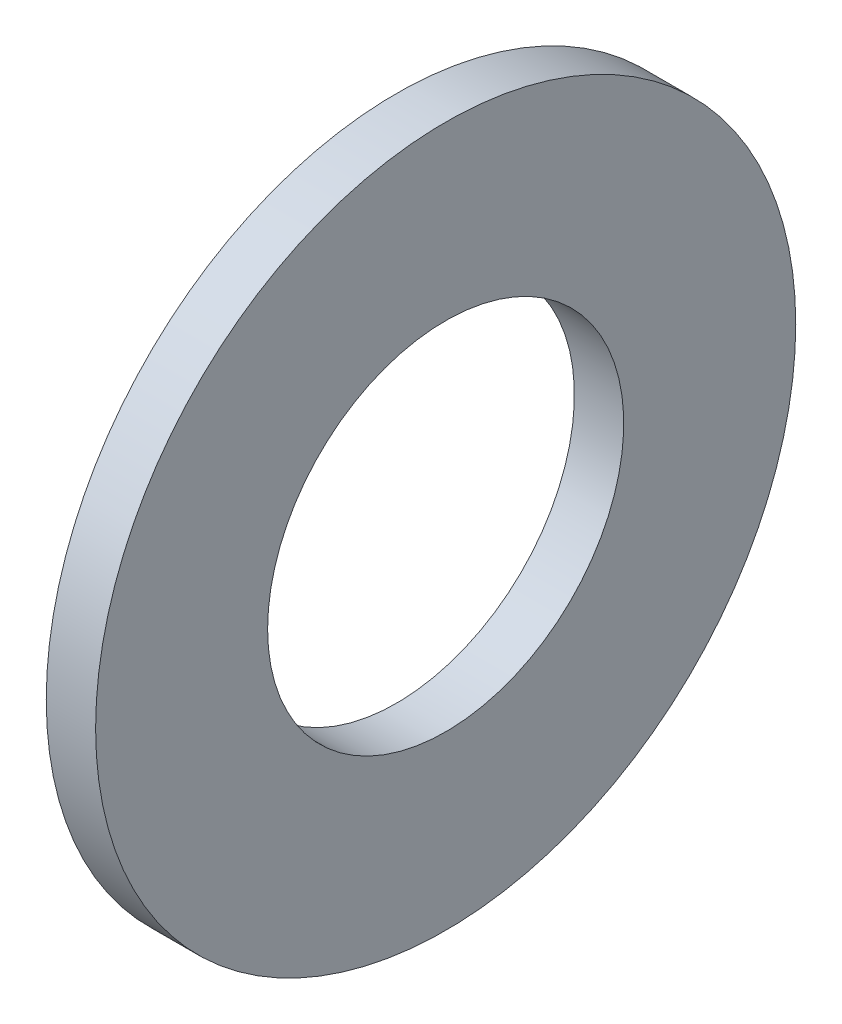
ISO-10303-21;
HEADER;
FILE_DESCRIPTION(('STEP AP214'),'2;1');
FILE_NAME('part.step','',(''),(''),'','','');
FILE_SCHEMA(('AUTOMOTIVE_DESIGN { 1 0 10303 214 1 1 1 1 }'));
ENDSEC;
DATA;
#1=APPLICATION_CONTEXT('core data for automotive mechanical design processes');
#2=APPLICATION_PROTOCOL_DEFINITION('international standard','automotive_design',2000,#1);
#3=PRODUCT_CONTEXT('',#1,'mechanical');
#4=PRODUCT('Part','Part','',(#3));
#5=PRODUCT_RELATED_PRODUCT_CATEGORY('part','',(#4));
#6=PRODUCT_DEFINITION_FORMATION('','',#4);
#7=PRODUCT_DEFINITION_CONTEXT('part definition',#1,'design');
#8=PRODUCT_DEFINITION('design','',#6,#7);
#9=PRODUCT_DEFINITION_SHAPE('','',#8);
#10=(LENGTH_UNIT() NAMED_UNIT(*) SI_UNIT(.MILLI.,.METRE.));
#11=(NAMED_UNIT(*) PLANE_ANGLE_UNIT() SI_UNIT($,.RADIAN.));
#12=(NAMED_UNIT(*) SI_UNIT($,.STERADIAN.) SOLID_ANGLE_UNIT());
#13=UNCERTAINTY_MEASURE_WITH_UNIT(LENGTH_MEASURE(1.E-05),#10,'distance_accuracy_value','');
#14=(GEOMETRIC_REPRESENTATION_CONTEXT(3) GLOBAL_UNCERTAINTY_ASSIGNED_CONTEXT((#13)) GLOBAL_UNIT_ASSIGNED_CONTEXT((#10,
#11,#12)) REPRESENTATION_CONTEXT('',''));
#15=CARTESIAN_POINT('',(0.,0.,0.));
#16=DIRECTION('',(0.,0.,1.));
#17=DIRECTION('',(1.,0.,0.));
#18=AXIS2_PLACEMENT_3D('',#15,#16,#17);
#19=CARTESIAN_POINT('',(-34.9249999999999,0.,0.));
#20=DIRECTION('',(-1.,0.,0.));
#21=DIRECTION('',(0.,0.,1.));
#22=AXIS2_PLACEMENT_3D('',#19,#20,#21);
#23=CYLINDRICAL_SURFACE('',#22,5.9563);
#24=CARTESIAN_POINT('',(0.,0.,0.));
#25=DIRECTION('',(-1.,0.,0.));
#26=DIRECTION('',(0.,0.,1.));
#27=AXIS2_PLACEMENT_3D('',#24,#25,#26);
#28=CIRCLE('',#27,5.9563);
#29=CARTESIAN_POINT('',(0.,0.,5.9563));
#30=VERTEX_POINT('',#29);
#31=EDGE_CURVE('E10',#30,#30,#28,.T.);
#32=ORIENTED_EDGE('',*,*,#31,.F.);
#33=EDGE_LOOP('',(#32));
#34=FACE_BOUND('',#33,.T.);
#35=CARTESIAN_POINT('',(-1.651,0.,0.));
#36=DIRECTION('',(-1.,0.,0.));
#37=DIRECTION('',(0.,0.,1.));
#38=AXIS2_PLACEMENT_3D('',#35,#36,#37);
#39=CIRCLE('',#38,5.9563);
#40=CARTESIAN_POINT('',(-1.651,0.,5.9563));
#41=VERTEX_POINT('',#40);
#42=EDGE_CURVE('E46',#41,#41,#39,.T.);
#43=ORIENTED_EDGE('',*,*,#42,.T.);
#44=EDGE_LOOP('',(#43));
#45=FACE_BOUND('',#44,.T.);
#46=ADVANCED_FACE('F32',(#34,#45),#23,.F.);
#47=CARTESIAN_POINT('',(0.,5.9563,0.));
#48=DIRECTION('',(-1.,0.,0.));
#49=DIRECTION('',(0.,0.,1.));
#50=AXIS2_PLACEMENT_3D('',#47,#48,#49);
#51=PLANE('',#50);
#52=CARTESIAN_POINT('',(0.,0.,0.));
#53=DIRECTION('',(-1.,0.,0.));
#54=DIRECTION('',(0.,0.,1.));
#55=AXIS2_PLACEMENT_3D('',#52,#53,#54);
#56=CIRCLE('',#55,11.7094);
#57=CARTESIAN_POINT('',(0.,0.,11.7094));
#58=VERTEX_POINT('',#57);
#59=EDGE_CURVE('E38',#58,#58,#56,.T.);
#60=ORIENTED_EDGE('',*,*,#59,.F.);
#61=EDGE_LOOP('',(#60));
#62=FACE_BOUND('',#61,.T.);
#63=ORIENTED_EDGE('',*,*,#31,.T.);
#64=EDGE_LOOP('',(#63));
#65=FACE_BOUND('',#64,.T.);
#66=ADVANCED_FACE('F61',(#62,#65),#51,.F.);
#67=CARTESIAN_POINT('',(-34.9249999999999,0.,0.));
#68=DIRECTION('',(-1.,0.,0.));
#69=DIRECTION('',(0.,0.,1.));
#70=AXIS2_PLACEMENT_3D('',#67,#68,#69);
#71=CYLINDRICAL_SURFACE('',#70,11.7094);
#72=CARTESIAN_POINT('',(-1.651,0.,0.));
#73=DIRECTION('',(-1.,0.,0.));
#74=DIRECTION('',(0.,0.,1.));
#75=AXIS2_PLACEMENT_3D('',#72,#73,#74);
#76=CIRCLE('',#75,11.7094);
#77=CARTESIAN_POINT('',(-1.651,0.,11.7094));
#78=VERTEX_POINT('',#77);
#79=EDGE_CURVE('E42',#78,#78,#76,.T.);
#80=ORIENTED_EDGE('',*,*,#79,.F.);
#81=EDGE_LOOP('',(#80));
#82=FACE_BOUND('',#81,.T.);
#83=ORIENTED_EDGE('',*,*,#59,.T.);
#84=EDGE_LOOP('',(#83));
#85=FACE_BOUND('',#84,.T.);
#86=ADVANCED_FACE('F56',(#82,#85),#71,.T.);
#87=CARTESIAN_POINT('',(-1.651,11.7094,0.));
#88=DIRECTION('',(1.,0.,0.));
#89=DIRECTION('',(0.,0.,-1.));
#90=AXIS2_PLACEMENT_3D('',#87,#88,#89);
#91=PLANE('',#90);
#92=ORIENTED_EDGE('',*,*,#42,.F.);
#93=EDGE_LOOP('',(#92));
#94=FACE_BOUND('',#93,.T.);
#95=ORIENTED_EDGE('',*,*,#79,.T.);
#96=EDGE_LOOP('',(#95));
#97=FACE_BOUND('',#96,.T.);
#98=ADVANCED_FACE('F53',(#94,#97),#91,.F.);
#99=CLOSED_SHELL('',(#46,#66,#86,#98));
#100=MANIFOLD_SOLID_BREP('B2',#99);
#101=ADVANCED_BREP_SHAPE_REPRESENTATION('',(#18,#100),#14);
#102=SHAPE_DEFINITION_REPRESENTATION(#9,#101);
ENDSEC;
END-ISO-10303-21;
